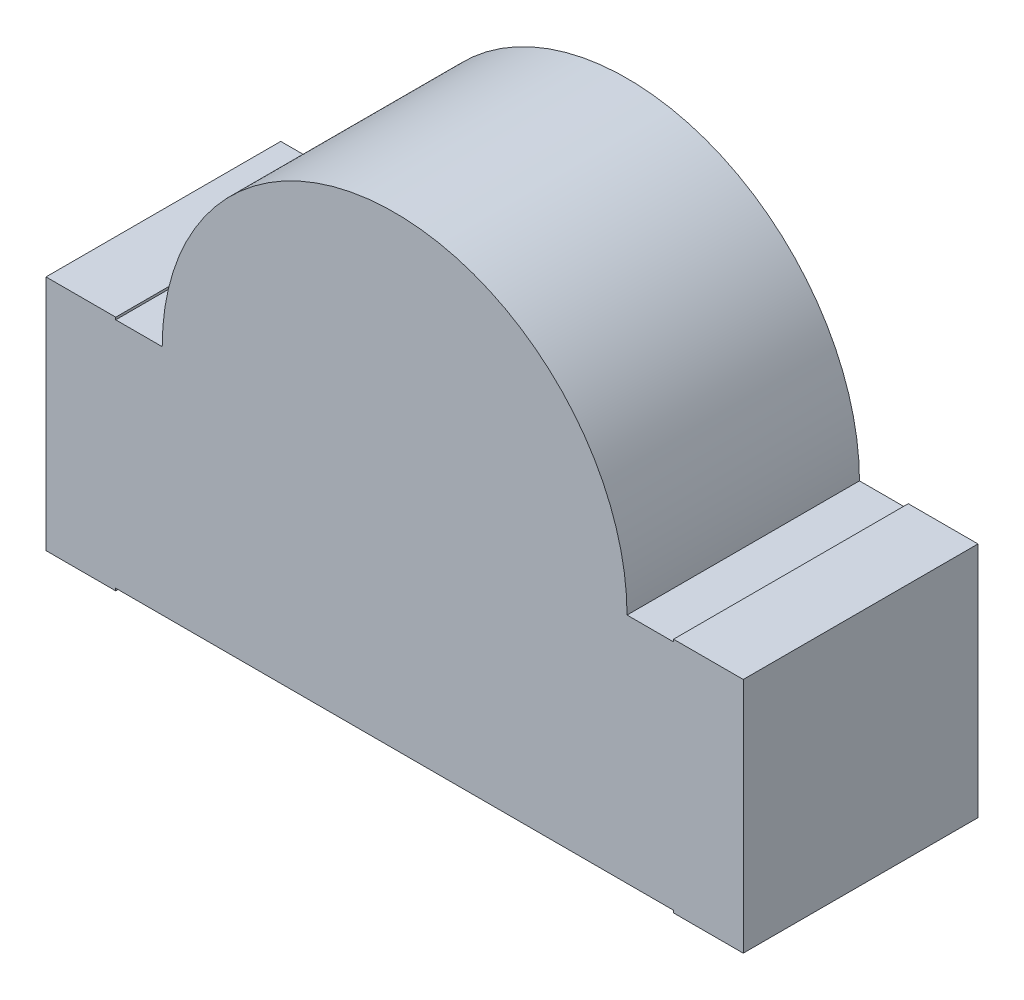
ISO-10303-21;
HEADER;
FILE_DESCRIPTION(('STEP AP214'),'2;1');
FILE_NAME('part.step','',(''),(''),'','','');
FILE_SCHEMA(('AUTOMOTIVE_DESIGN { 1 0 10303 214 1 1 1 1 }'));
ENDSEC;
DATA;
#1=APPLICATION_CONTEXT('core data for automotive mechanical design processes');
#2=APPLICATION_PROTOCOL_DEFINITION('international standard','automotive_design',2000,#1);
#3=PRODUCT_CONTEXT('',#1,'mechanical');
#4=PRODUCT('Part','Part','',(#3));
#5=PRODUCT_RELATED_PRODUCT_CATEGORY('part','',(#4));
#6=PRODUCT_DEFINITION_FORMATION('','',#4);
#7=PRODUCT_DEFINITION_CONTEXT('part definition',#1,'design');
#8=PRODUCT_DEFINITION('design','',#6,#7);
#9=PRODUCT_DEFINITION_SHAPE('','',#8);
#10=(LENGTH_UNIT() NAMED_UNIT(*) SI_UNIT(.MILLI.,.METRE.));
#11=(NAMED_UNIT(*) PLANE_ANGLE_UNIT() SI_UNIT($,.RADIAN.));
#12=(NAMED_UNIT(*) SI_UNIT($,.STERADIAN.) SOLID_ANGLE_UNIT());
#13=UNCERTAINTY_MEASURE_WITH_UNIT(LENGTH_MEASURE(1.E-05),#10,'distance_accuracy_value','');
#14=(GEOMETRIC_REPRESENTATION_CONTEXT(3) GLOBAL_UNCERTAINTY_ASSIGNED_CONTEXT((#13)) GLOBAL_UNIT_ASSIGNED_CONTEXT((#10,
#11,#12)) REPRESENTATION_CONTEXT('',''));
#15=CARTESIAN_POINT('',(0.,0.,0.));
#16=DIRECTION('',(0.,0.,1.));
#17=DIRECTION('',(1.,0.,0.));
#18=AXIS2_PLACEMENT_3D('',#15,#16,#17);
#19=CARTESIAN_POINT('',(0.,0.,1.));
#20=DIRECTION('',(0.,1.,0.));
#21=DIRECTION('',(0.,0.,1.));
#22=AXIS2_PLACEMENT_3D('',#19,#20,#21);
#23=PLANE('',#22);
#24=DIRECTION('',(1.,0.,0.));
#25=VECTOR('',#24,1.);
#26=CARTESIAN_POINT('',(0.,0.,1.));
#27=LINE('',#26,#25);
#28=CARTESIAN_POINT('',(0.3,0.,1.));
#29=VERTEX_POINT('',#28);
#30=CARTESIAN_POINT('',(2.7,0.,1.));
#31=VERTEX_POINT('',#30);
#32=EDGE_CURVE('E235',#29,#31,#27,.T.);
#33=ORIENTED_EDGE('',*,*,#32,.F.);
#34=DIRECTION('',(0.,0.,-1.));
#35=VECTOR('',#34,1.);
#36=CARTESIAN_POINT('',(0.3,0.,1.));
#37=LINE('',#36,#35);
#38=CARTESIAN_POINT('',(0.3,0.,0.));
#39=VERTEX_POINT('',#38);
#40=EDGE_CURVE('E168',#29,#39,#37,.T.);
#41=ORIENTED_EDGE('',*,*,#40,.T.);
#42=DIRECTION('',(1.,0.,0.));
#43=VECTOR('',#42,1.);
#44=CARTESIAN_POINT('',(0.,0.,0.));
#45=LINE('',#44,#43);
#46=CARTESIAN_POINT('',(2.7,0.,0.));
#47=VERTEX_POINT('',#46);
#48=EDGE_CURVE('E233',#39,#47,#45,.T.);
#49=ORIENTED_EDGE('',*,*,#48,.T.);
#50=DIRECTION('',(0.,0.,1.));
#51=VECTOR('',#50,1.);
#52=CARTESIAN_POINT('',(2.7,0.,1.));
#53=LINE('',#52,#51);
#54=EDGE_CURVE('E230',#47,#31,#53,.T.);
#55=ORIENTED_EDGE('',*,*,#54,.T.);
#56=EDGE_LOOP('',(#33,#41,#49,#55));
#57=FACE_BOUND('',#56,.T.);
#58=DIRECTION('',(-0.866025403784439,0.,-0.5));
#59=VECTOR('',#58,1.);
#60=CARTESIAN_POINT('',(0.627494000274346,0.,-0.0868514899198057));
#61=LINE('',#60,#59);
#62=CARTESIAN_POINT('',(2.2,0.,0.821035272324104));
#63=VERTEX_POINT('',#62);
#64=CARTESIAN_POINT('',(1.64395059731294,0.,0.5));
#65=VERTEX_POINT('',#64);
#66=EDGE_CURVE('E53',#63,#65,#61,.T.);
#67=ORIENTED_EDGE('',*,*,#66,.F.);
#68=DIRECTION('',(0.,0.,1.));
#69=VECTOR('',#68,1.);
#70=CARTESIAN_POINT('',(2.2,0.,1.));
#71=LINE('',#70,#69);
#72=CARTESIAN_POINT('',(2.2,0.,0.178964727675896));
#73=VERTEX_POINT('',#72);
#74=EDGE_CURVE('E259',#73,#63,#71,.T.);
#75=ORIENTED_EDGE('',*,*,#74,.F.);
#76=DIRECTION('',(0.866025403784439,0.,-0.5));
#77=VECTOR('',#76,1.);
#78=CARTESIAN_POINT('',(0.194481298382126,0.,1.33685148991981));
#79=LINE('',#78,#77);
#80=EDGE_CURVE('E262',#65,#73,#79,.T.);
#81=ORIENTED_EDGE('',*,*,#80,.F.);
#82=EDGE_LOOP('',(#67,#75,#81));
#83=FACE_BOUND('',#82,.T.);
#84=ADVANCED_FACE('F38',(#57,#83),#23,.F.);
#85=CARTESIAN_POINT('',(0.,0.,1.));
#86=DIRECTION('',(1.,0.,0.));
#87=DIRECTION('',(0.,0.,-1.));
#88=AXIS2_PLACEMENT_3D('',#85,#86,#87);
#89=PLANE('',#88);
#90=DIRECTION('',(0.,-1.,0.));
#91=VECTOR('',#90,1.);
#92=CARTESIAN_POINT('',(0.,0.,1.));
#93=LINE('',#92,#91);
#94=CARTESIAN_POINT('',(0.,1.01,1.));
#95=VERTEX_POINT('',#94);
#96=CARTESIAN_POINT('',(0.,-0.01,1.));
#97=VERTEX_POINT('',#96);
#98=EDGE_CURVE('E153',#95,#97,#93,.T.);
#99=ORIENTED_EDGE('',*,*,#98,.F.);
#100=DIRECTION('',(0.,0.,-1.));
#101=VECTOR('',#100,1.);
#102=CARTESIAN_POINT('',(0.,1.01,-0.01));
#103=LINE('',#102,#101);
#104=CARTESIAN_POINT('',(0.,1.01,-0.01));
#105=VERTEX_POINT('',#104);
#106=EDGE_CURVE('E177',#95,#105,#103,.T.);
#107=ORIENTED_EDGE('',*,*,#106,.T.);
#108=DIRECTION('',(0.,-1.,0.));
#109=VECTOR('',#108,1.);
#110=CARTESIAN_POINT('',(0.,-0.01,-0.01));
#111=LINE('',#110,#109);
#112=CARTESIAN_POINT('',(0.,-0.01,-0.01));
#113=VERTEX_POINT('',#112);
#114=EDGE_CURVE('E174',#105,#113,#111,.T.);
#115=ORIENTED_EDGE('',*,*,#114,.T.);
#116=DIRECTION('',(0.,0.,1.));
#117=VECTOR('',#116,1.);
#118=CARTESIAN_POINT('',(0.,-0.01,1.));
#119=LINE('',#118,#117);
#120=EDGE_CURVE('E183',#113,#97,#119,.T.);
#121=ORIENTED_EDGE('',*,*,#120,.T.);
#122=EDGE_LOOP('',(#99,#107,#115,#121));
#123=FACE_BOUND('',#122,.T.);
#124=ADVANCED_FACE('F40',(#123),#89,.F.);
#125=ORIENTED_EDGE('',*,*,#74,.T.);
#126=ORIENTED_EDGE('',*,*,#66,.T.);
#127=ORIENTED_EDGE('',*,*,#80,.T.);
#128=EDGE_LOOP('',(#125,#126,#127));
#129=FACE_BOUND('',#128,.T.);
#130=ADVANCED_FACE('F298',(#129),#23,.F.);
#131=CARTESIAN_POINT('',(3.,0.,1.));
#132=DIRECTION('',(-1.,0.,0.));
#133=DIRECTION('',(0.,0.,1.));
#134=AXIS2_PLACEMENT_3D('',#131,#132,#133);
#135=PLANE('',#134);
#136=DIRECTION('',(0.,1.,0.));
#137=VECTOR('',#136,1.);
#138=CARTESIAN_POINT('',(3.,0.,1.));
#139=LINE('',#138,#137);
#140=CARTESIAN_POINT('',(3.,-0.01,1.));
#141=VERTEX_POINT('',#140);
#142=CARTESIAN_POINT('',(3.,1.01,1.));
#143=VERTEX_POINT('',#142);
#144=EDGE_CURVE('E238',#141,#143,#139,.T.);
#145=ORIENTED_EDGE('',*,*,#144,.F.);
#146=DIRECTION('',(0.,0.,-1.));
#147=VECTOR('',#146,1.);
#148=CARTESIAN_POINT('',(3.,-0.01,1.));
#149=LINE('',#148,#147);
#150=CARTESIAN_POINT('',(3.,-0.01,-0.01));
#151=VERTEX_POINT('',#150);
#152=EDGE_CURVE('E195',#141,#151,#149,.T.);
#153=ORIENTED_EDGE('',*,*,#152,.T.);
#154=DIRECTION('',(0.,1.,0.));
#155=VECTOR('',#154,1.);
#156=CARTESIAN_POINT('',(3.,-0.01,-0.01));
#157=LINE('',#156,#155);
#158=CARTESIAN_POINT('',(3.,1.01,-0.01));
#159=VERTEX_POINT('',#158);
#160=EDGE_CURVE('E212',#151,#159,#157,.T.);
#161=ORIENTED_EDGE('',*,*,#160,.T.);
#162=DIRECTION('',(0.,0.,1.));
#163=VECTOR('',#162,1.);
#164=CARTESIAN_POINT('',(3.,1.01,1.));
#165=LINE('',#164,#163);
#166=EDGE_CURVE('E215',#159,#143,#165,.T.);
#167=ORIENTED_EDGE('',*,*,#166,.T.);
#168=EDGE_LOOP('',(#145,#153,#161,#167));
#169=FACE_BOUND('',#168,.T.);
#170=ADVANCED_FACE('F305',(#169),#135,.F.);
#171=CARTESIAN_POINT('',(2.5,1.,1.));
#172=DIRECTION('',(0.,-1.,0.));
#173=DIRECTION('',(1.,0.,0.));
#174=AXIS2_PLACEMENT_3D('',#171,#172,#173);
#175=PLANE('',#174);
#176=DIRECTION('',(-1.,0.,0.));
#177=VECTOR('',#176,1.);
#178=CARTESIAN_POINT('',(2.5,1.,1.));
#179=LINE('',#178,#177);
#180=CARTESIAN_POINT('',(2.7,1.,1.));
#181=VERTEX_POINT('',#180);
#182=CARTESIAN_POINT('',(2.5,1.,1.));
#183=VERTEX_POINT('',#182);
#184=EDGE_CURVE('E240',#181,#183,#179,.T.);
#185=ORIENTED_EDGE('',*,*,#184,.F.);
#186=DIRECTION('',(0.,0.,-1.));
#187=VECTOR('',#186,1.);
#188=CARTESIAN_POINT('',(2.7,1.,1.));
#189=LINE('',#188,#187);
#190=CARTESIAN_POINT('',(2.7,1.,0.));
#191=VERTEX_POINT('',#190);
#192=EDGE_CURVE('E221',#181,#191,#189,.T.);
#193=ORIENTED_EDGE('',*,*,#192,.T.);
#194=DIRECTION('',(-1.,0.,0.));
#195=VECTOR('',#194,1.);
#196=CARTESIAN_POINT('',(2.5,1.,0.));
#197=LINE('',#196,#195);
#198=CARTESIAN_POINT('',(2.5,1.,0.));
#199=VERTEX_POINT('',#198);
#200=EDGE_CURVE('E248',#191,#199,#197,.T.);
#201=ORIENTED_EDGE('',*,*,#200,.T.);
#202=DIRECTION('',(0.,0.,-1.));
#203=VECTOR('',#202,1.);
#204=CARTESIAN_POINT('',(2.5,1.,1.));
#205=LINE('',#204,#203);
#206=EDGE_CURVE('E256',#183,#199,#205,.T.);
#207=ORIENTED_EDGE('',*,*,#206,.F.);
#208=EDGE_LOOP('',(#185,#193,#201,#207));
#209=FACE_BOUND('',#208,.T.);
#210=ADVANCED_FACE('F279',(#209),#175,.F.);
#211=CARTESIAN_POINT('',(1.5,1.,1.));
#212=DIRECTION('',(0.,0.,-1.));
#213=DIRECTION('',(-1.,0.,0.));
#214=AXIS2_PLACEMENT_3D('',#211,#212,#213);
#215=CYLINDRICAL_SURFACE('',#214,1.);
#216=CARTESIAN_POINT('',(1.5,1.,0.));
#217=DIRECTION('',(0.,0.,1.));
#218=DIRECTION('',(1.,0.,0.));
#219=AXIS2_PLACEMENT_3D('',#216,#217,#218);
#220=CIRCLE('',#219,1.);
#221=CARTESIAN_POINT('',(0.500000000000001,1.,0.));
#222=VERTEX_POINT('',#221);
#223=EDGE_CURVE('E250',#199,#222,#220,.T.);
#224=ORIENTED_EDGE('',*,*,#223,.T.);
#225=DIRECTION('',(0.,0.,-1.));
#226=VECTOR('',#225,1.);
#227=CARTESIAN_POINT('',(0.500000000000001,1.,1.));
#228=LINE('',#227,#226);
#229=CARTESIAN_POINT('',(0.500000000000001,1.,1.));
#230=VERTEX_POINT('',#229);
#231=EDGE_CURVE('E246',#230,#222,#228,.T.);
#232=ORIENTED_EDGE('',*,*,#231,.F.);
#233=CARTESIAN_POINT('',(1.5,1.,1.));
#234=DIRECTION('',(0.,0.,1.));
#235=DIRECTION('',(1.,0.,0.));
#236=AXIS2_PLACEMENT_3D('',#233,#234,#235);
#237=CIRCLE('',#236,1.);
#238=EDGE_CURVE('E242',#183,#230,#237,.T.);
#239=ORIENTED_EDGE('',*,*,#238,.F.);
#240=ORIENTED_EDGE('',*,*,#206,.T.);
#241=EDGE_LOOP('',(#224,#232,#239,#240));
#242=FACE_BOUND('',#241,.T.);
#243=ADVANCED_FACE('F313',(#242),#215,.T.);
#244=CARTESIAN_POINT('',(0.,1.,1.));
#245=DIRECTION('',(0.,-1.,0.));
#246=DIRECTION('',(1.,0.,0.));
#247=AXIS2_PLACEMENT_3D('',#244,#245,#246);
#248=PLANE('',#247);
#249=DIRECTION('',(-1.,0.,0.));
#250=VECTOR('',#249,1.);
#251=CARTESIAN_POINT('',(0.,1.,0.));
#252=LINE('',#251,#250);
#253=CARTESIAN_POINT('',(0.3,1.,0.));
#254=VERTEX_POINT('',#253);
#255=EDGE_CURVE('E236',#222,#254,#252,.T.);
#256=ORIENTED_EDGE('',*,*,#255,.T.);
#257=DIRECTION('',(0.,0.,1.));
#258=VECTOR('',#257,1.);
#259=CARTESIAN_POINT('',(0.3,1.,1.));
#260=LINE('',#259,#258);
#261=CARTESIAN_POINT('',(0.3,1.,1.));
#262=VERTEX_POINT('',#261);
#263=EDGE_CURVE('E188',#254,#262,#260,.T.);
#264=ORIENTED_EDGE('',*,*,#263,.T.);
#265=DIRECTION('',(-1.,0.,0.));
#266=VECTOR('',#265,1.);
#267=CARTESIAN_POINT('',(0.,1.,1.));
#268=LINE('',#267,#266);
#269=EDGE_CURVE('E244',#230,#262,#268,.T.);
#270=ORIENTED_EDGE('',*,*,#269,.F.);
#271=ORIENTED_EDGE('',*,*,#231,.T.);
#272=EDGE_LOOP('',(#256,#264,#270,#271));
#273=FACE_BOUND('',#272,.T.);
#274=ADVANCED_FACE('F318',(#273),#248,.F.);
#275=CARTESIAN_POINT('',(1.5,1.,1.));
#276=DIRECTION('',(0.,0.,1.));
#277=DIRECTION('',(1.,0.,0.));
#278=AXIS2_PLACEMENT_3D('',#275,#276,#277);
#279=PLANE('',#278);
#280=ORIENTED_EDGE('',*,*,#269,.T.);
#281=DIRECTION('',(0.,1.,0.));
#282=VECTOR('',#281,1.);
#283=CARTESIAN_POINT('',(0.3,0.,1.));
#284=LINE('',#283,#282);
#285=CARTESIAN_POINT('',(0.3,1.01,1.));
#286=VERTEX_POINT('',#285);
#287=EDGE_CURVE('E170',#262,#286,#284,.T.);
#288=ORIENTED_EDGE('',*,*,#287,.T.);
#289=DIRECTION('',(-1.,0.,0.));
#290=VECTOR('',#289,1.);
#291=CARTESIAN_POINT('',(0.3,1.01,1.));
#292=LINE('',#291,#290);
#293=EDGE_CURVE('E158',#286,#95,#292,.T.);
#294=ORIENTED_EDGE('',*,*,#293,.T.);
#295=ORIENTED_EDGE('',*,*,#98,.T.);
#296=DIRECTION('',(-1.,0.,0.));
#297=VECTOR('',#296,1.);
#298=CARTESIAN_POINT('',(0.3,-0.01,1.));
#299=LINE('',#298,#297);
#300=CARTESIAN_POINT('',(0.3,-0.01,1.));
#301=VERTEX_POINT('',#300);
#302=EDGE_CURVE('E146',#301,#97,#299,.T.);
#303=ORIENTED_EDGE('',*,*,#302,.F.);
#304=EDGE_CURVE('E150',#301,#29,#284,.T.);
#305=ORIENTED_EDGE('',*,*,#304,.T.);
#306=ORIENTED_EDGE('',*,*,#32,.T.);
#307=DIRECTION('',(0.,-1.,0.));
#308=VECTOR('',#307,1.);
#309=CARTESIAN_POINT('',(2.7,-0.01,1.));
#310=LINE('',#309,#308);
#311=CARTESIAN_POINT('',(2.7,-0.01,1.));
#312=VERTEX_POINT('',#311);
#313=EDGE_CURVE('E200',#31,#312,#310,.T.);
#314=ORIENTED_EDGE('',*,*,#313,.T.);
#315=DIRECTION('',(1.,0.,0.));
#316=VECTOR('',#315,1.);
#317=CARTESIAN_POINT('',(2.7,-0.01,1.));
#318=LINE('',#317,#316);
#319=EDGE_CURVE('E209',#312,#141,#318,.T.);
#320=ORIENTED_EDGE('',*,*,#319,.T.);
#321=ORIENTED_EDGE('',*,*,#144,.T.);
#322=DIRECTION('',(1.,0.,0.));
#323=VECTOR('',#322,1.);
#324=CARTESIAN_POINT('',(2.7,1.01,1.));
#325=LINE('',#324,#323);
#326=CARTESIAN_POINT('',(2.7,1.01,1.));
#327=VERTEX_POINT('',#326);
#328=EDGE_CURVE('E218',#327,#143,#325,.T.);
#329=ORIENTED_EDGE('',*,*,#328,.F.);
#330=EDGE_CURVE('E196',#327,#181,#310,.T.);
#331=ORIENTED_EDGE('',*,*,#330,.T.);
#332=ORIENTED_EDGE('',*,*,#184,.T.);
#333=ORIENTED_EDGE('',*,*,#238,.T.);
#334=EDGE_LOOP('',(#280,#288,#294,#295,#303,#305,#306,#314,#320,#321,#329,#331,#332,#333));
#335=FACE_BOUND('',#334,.T.);
#336=ADVANCED_FACE('F149',(#335),#279,.T.);
#337=CARTESIAN_POINT('',(1.5,1.,0.));
#338=DIRECTION('',(0.,0.,1.));
#339=DIRECTION('',(1.,0.,0.));
#340=AXIS2_PLACEMENT_3D('',#337,#338,#339);
#341=PLANE('',#340);
#342=ORIENTED_EDGE('',*,*,#48,.F.);
#343=DIRECTION('',(0.,1.,0.));
#344=VECTOR('',#343,1.);
#345=CARTESIAN_POINT('',(0.3,1.,0.));
#346=LINE('',#345,#344);
#347=EDGE_CURVE('E11',#39,#254,#346,.T.);
#348=ORIENTED_EDGE('',*,*,#347,.T.);
#349=ORIENTED_EDGE('',*,*,#255,.F.);
#350=ORIENTED_EDGE('',*,*,#223,.F.);
#351=ORIENTED_EDGE('',*,*,#200,.F.);
#352=DIRECTION('',(0.,-1.,0.));
#353=VECTOR('',#352,1.);
#354=CARTESIAN_POINT('',(2.7,1.,0.));
#355=LINE('',#354,#353);
#356=EDGE_CURVE('E46',#191,#47,#355,.T.);
#357=ORIENTED_EDGE('',*,*,#356,.T.);
#358=EDGE_LOOP('',(#342,#348,#349,#350,#351,#357));
#359=FACE_BOUND('',#358,.T.);
#360=ADVANCED_FACE('F270',(#359),#341,.F.);
#361=CARTESIAN_POINT('',(2.7,0.,0.));
#362=DIRECTION('',(-1.,0.,0.));
#363=DIRECTION('',(0.,0.,1.));
#364=AXIS2_PLACEMENT_3D('',#361,#362,#363);
#365=PLANE('',#364);
#366=ORIENTED_EDGE('',*,*,#54,.F.);
#367=ORIENTED_EDGE('',*,*,#356,.F.);
#368=ORIENTED_EDGE('',*,*,#192,.F.);
#369=ORIENTED_EDGE('',*,*,#330,.F.);
#370=DIRECTION('',(0.,0.,1.));
#371=VECTOR('',#370,1.);
#372=CARTESIAN_POINT('',(2.7,1.01,1.));
#373=LINE('',#372,#371);
#374=CARTESIAN_POINT('',(2.7,1.01,-0.01));
#375=VERTEX_POINT('',#374);
#376=EDGE_CURVE('E206',#375,#327,#373,.T.);
#377=ORIENTED_EDGE('',*,*,#376,.F.);
#378=DIRECTION('',(0.,1.,0.));
#379=VECTOR('',#378,1.);
#380=CARTESIAN_POINT('',(2.7,-0.01,-0.01));
#381=LINE('',#380,#379);
#382=CARTESIAN_POINT('',(2.7,-0.01,-0.01));
#383=VERTEX_POINT('',#382);
#384=EDGE_CURVE('E203',#383,#375,#381,.T.);
#385=ORIENTED_EDGE('',*,*,#384,.F.);
#386=DIRECTION('',(0.,0.,-1.));
#387=VECTOR('',#386,1.);
#388=CARTESIAN_POINT('',(2.7,-0.01,1.));
#389=LINE('',#388,#387);
#390=EDGE_CURVE('E199',#312,#383,#389,.T.);
#391=ORIENTED_EDGE('',*,*,#390,.F.);
#392=ORIENTED_EDGE('',*,*,#313,.F.);
#393=EDGE_LOOP('',(#366,#367,#368,#369,#377,#385,#391,#392));
#394=FACE_BOUND('',#393,.T.);
#395=ADVANCED_FACE('F274',(#394),#365,.T.);
#396=CARTESIAN_POINT('',(2.7,1.01,1.));
#397=DIRECTION('',(0.,1.,0.));
#398=DIRECTION('',(0.,0.,1.));
#399=AXIS2_PLACEMENT_3D('',#396,#397,#398);
#400=PLANE('',#399);
#401=ORIENTED_EDGE('',*,*,#166,.F.);
#402=DIRECTION('',(1.,0.,0.));
#403=VECTOR('',#402,1.);
#404=CARTESIAN_POINT('',(2.7,1.01,-0.01));
#405=LINE('',#404,#403);
#406=EDGE_CURVE('E222',#375,#159,#405,.T.);
#407=ORIENTED_EDGE('',*,*,#406,.F.);
#408=ORIENTED_EDGE('',*,*,#376,.T.);
#409=ORIENTED_EDGE('',*,*,#328,.T.);
#410=EDGE_LOOP('',(#401,#407,#408,#409));
#411=FACE_BOUND('',#410,.T.);
#412=ADVANCED_FACE('F287',(#411),#400,.T.);
#413=CARTESIAN_POINT('',(2.7,-0.01,-0.01));
#414=DIRECTION('',(0.,0.,-1.));
#415=DIRECTION('',(-1.,0.,0.));
#416=AXIS2_PLACEMENT_3D('',#413,#414,#415);
#417=PLANE('',#416);
#418=ORIENTED_EDGE('',*,*,#160,.F.);
#419=DIRECTION('',(1.,0.,0.));
#420=VECTOR('',#419,1.);
#421=CARTESIAN_POINT('',(2.7,-0.01,-0.01));
#422=LINE('',#421,#420);
#423=EDGE_CURVE('E224',#383,#151,#422,.T.);
#424=ORIENTED_EDGE('',*,*,#423,.F.);
#425=ORIENTED_EDGE('',*,*,#384,.T.);
#426=ORIENTED_EDGE('',*,*,#406,.T.);
#427=EDGE_LOOP('',(#418,#424,#425,#426));
#428=FACE_BOUND('',#427,.T.);
#429=ADVANCED_FACE('F290',(#428),#417,.T.);
#430=CARTESIAN_POINT('',(2.7,-0.01,1.));
#431=DIRECTION('',(0.,-1.,0.));
#432=DIRECTION('',(0.,0.,-1.));
#433=AXIS2_PLACEMENT_3D('',#430,#431,#432);
#434=PLANE('',#433);
#435=ORIENTED_EDGE('',*,*,#152,.F.);
#436=ORIENTED_EDGE('',*,*,#319,.F.);
#437=ORIENTED_EDGE('',*,*,#390,.T.);
#438=ORIENTED_EDGE('',*,*,#423,.T.);
#439=EDGE_LOOP('',(#435,#436,#437,#438));
#440=FACE_BOUND('',#439,.T.);
#441=ADVANCED_FACE('F295',(#440),#434,.T.);
#442=CARTESIAN_POINT('',(0.3,0.,0.));
#443=DIRECTION('',(1.,0.,0.));
#444=DIRECTION('',(0.,0.,-1.));
#445=AXIS2_PLACEMENT_3D('',#442,#443,#444);
#446=PLANE('',#445);
#447=ORIENTED_EDGE('',*,*,#40,.F.);
#448=ORIENTED_EDGE('',*,*,#304,.F.);
#449=DIRECTION('',(0.,0.,1.));
#450=VECTOR('',#449,1.);
#451=CARTESIAN_POINT('',(0.3,-0.01,1.));
#452=LINE('',#451,#450);
#453=CARTESIAN_POINT('',(0.3,-0.01,-0.01));
#454=VERTEX_POINT('',#453);
#455=EDGE_CURVE('E165',#454,#301,#452,.T.);
#456=ORIENTED_EDGE('',*,*,#455,.F.);
#457=DIRECTION('',(0.,-1.,0.));
#458=VECTOR('',#457,1.);
#459=CARTESIAN_POINT('',(0.3,-0.01,-0.01));
#460=LINE('',#459,#458);
#461=CARTESIAN_POINT('',(0.3,1.01,-0.01));
#462=VERTEX_POINT('',#461);
#463=EDGE_CURVE('E159',#462,#454,#460,.T.);
#464=ORIENTED_EDGE('',*,*,#463,.F.);
#465=DIRECTION('',(0.,0.,-1.));
#466=VECTOR('',#465,1.);
#467=CARTESIAN_POINT('',(0.3,1.01,-0.01));
#468=LINE('',#467,#466);
#469=EDGE_CURVE('E169',#286,#462,#468,.T.);
#470=ORIENTED_EDGE('',*,*,#469,.F.);
#471=ORIENTED_EDGE('',*,*,#287,.F.);
#472=ORIENTED_EDGE('',*,*,#263,.F.);
#473=ORIENTED_EDGE('',*,*,#347,.F.);
#474=EDGE_LOOP('',(#447,#448,#456,#464,#470,#471,#472,#473));
#475=FACE_BOUND('',#474,.T.);
#476=ADVANCED_FACE('F163',(#475),#446,.T.);
#477=CARTESIAN_POINT('',(0.3,-0.01,1.));
#478=DIRECTION('',(0.,-1.,0.));
#479=DIRECTION('',(0.,0.,-1.));
#480=AXIS2_PLACEMENT_3D('',#477,#478,#479);
#481=PLANE('',#480);
#482=ORIENTED_EDGE('',*,*,#120,.F.);
#483=DIRECTION('',(-1.,0.,0.));
#484=VECTOR('',#483,1.);
#485=CARTESIAN_POINT('',(0.3,-0.01,-0.01));
#486=LINE('',#485,#484);
#487=EDGE_CURVE('E173',#454,#113,#486,.T.);
#488=ORIENTED_EDGE('',*,*,#487,.F.);
#489=ORIENTED_EDGE('',*,*,#455,.T.);
#490=ORIENTED_EDGE('',*,*,#302,.T.);
#491=EDGE_LOOP('',(#482,#488,#489,#490));
#492=FACE_BOUND('',#491,.T.);
#493=ADVANCED_FACE('F172',(#492),#481,.T.);
#494=CARTESIAN_POINT('',(0.3,-0.01,-0.01));
#495=DIRECTION('',(0.,0.,-1.));
#496=DIRECTION('',(-1.,0.,0.));
#497=AXIS2_PLACEMENT_3D('',#494,#495,#496);
#498=PLANE('',#497);
#499=ORIENTED_EDGE('',*,*,#114,.F.);
#500=DIRECTION('',(-1.,0.,0.));
#501=VECTOR('',#500,1.);
#502=CARTESIAN_POINT('',(0.3,1.01,-0.01));
#503=LINE('',#502,#501);
#504=EDGE_CURVE('E189',#462,#105,#503,.T.);
#505=ORIENTED_EDGE('',*,*,#504,.F.);
#506=ORIENTED_EDGE('',*,*,#463,.T.);
#507=ORIENTED_EDGE('',*,*,#487,.T.);
#508=EDGE_LOOP('',(#499,#505,#506,#507));
#509=FACE_BOUND('',#508,.T.);
#510=ADVANCED_FACE('F337',(#509),#498,.T.);
#511=CARTESIAN_POINT('',(0.3,1.01,-0.01));
#512=DIRECTION('',(0.,1.,0.));
#513=DIRECTION('',(0.,0.,1.));
#514=AXIS2_PLACEMENT_3D('',#511,#512,#513);
#515=PLANE('',#514);
#516=ORIENTED_EDGE('',*,*,#106,.F.);
#517=ORIENTED_EDGE('',*,*,#293,.F.);
#518=ORIENTED_EDGE('',*,*,#469,.T.);
#519=ORIENTED_EDGE('',*,*,#504,.T.);
#520=EDGE_LOOP('',(#516,#517,#518,#519));
#521=FACE_BOUND('',#520,.T.);
#522=ADVANCED_FACE('F338',(#521),#515,.T.);
#523=CLOSED_SHELL('',(#84,#124,#130,#170,#210,#243,#274,#336,#360,#395,#412,#429,#441,#476,#493,
#510,#522));
#524=MANIFOLD_SOLID_BREP('B2',#523);
#525=ADVANCED_BREP_SHAPE_REPRESENTATION('',(#18,#524),#14);
#526=SHAPE_DEFINITION_REPRESENTATION(#9,#525);
ENDSEC;
END-ISO-10303-21;
